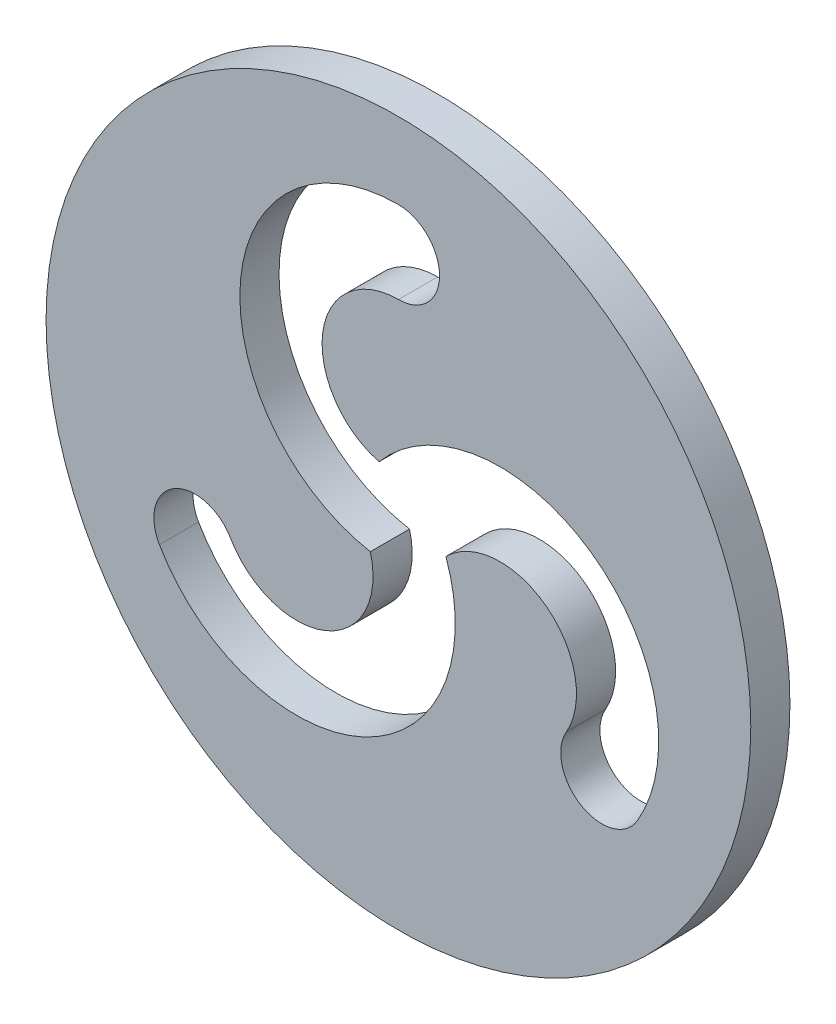
ISO-10303-21;
HEADER;
FILE_DESCRIPTION(('STEP AP214'),'2;1');
FILE_NAME('part.step','',(''),(''),'','','');
FILE_SCHEMA(('AUTOMOTIVE_DESIGN { 1 0 10303 214 1 1 1 1 }'));
ENDSEC;
DATA;
#1=APPLICATION_CONTEXT('core data for automotive mechanical design processes');
#2=APPLICATION_PROTOCOL_DEFINITION('international standard','automotive_design',2000,#1);
#3=PRODUCT_CONTEXT('',#1,'mechanical');
#4=PRODUCT('Part','Part','',(#3));
#5=PRODUCT_RELATED_PRODUCT_CATEGORY('part','',(#4));
#6=PRODUCT_DEFINITION_FORMATION('','',#4);
#7=PRODUCT_DEFINITION_CONTEXT('part definition',#1,'design');
#8=PRODUCT_DEFINITION('design','',#6,#7);
#9=PRODUCT_DEFINITION_SHAPE('','',#8);
#10=(LENGTH_UNIT() NAMED_UNIT(*) SI_UNIT(.MILLI.,.METRE.));
#11=(NAMED_UNIT(*) PLANE_ANGLE_UNIT() SI_UNIT($,.RADIAN.));
#12=(NAMED_UNIT(*) SI_UNIT($,.STERADIAN.) SOLID_ANGLE_UNIT());
#13=UNCERTAINTY_MEASURE_WITH_UNIT(LENGTH_MEASURE(1.E-05),#10,'distance_accuracy_value','');
#14=(GEOMETRIC_REPRESENTATION_CONTEXT(3) GLOBAL_UNCERTAINTY_ASSIGNED_CONTEXT((#13)) GLOBAL_UNIT_ASSIGNED_CONTEXT((#10,
#11,#12)) REPRESENTATION_CONTEXT('',''));
#15=CARTESIAN_POINT('',(0.,0.,0.));
#16=DIRECTION('',(0.,0.,1.));
#17=DIRECTION('',(1.,0.,0.));
#18=AXIS2_PLACEMENT_3D('',#15,#16,#17);
#19=CARTESIAN_POINT('',(0.,0.,5.));
#20=DIRECTION('',(0.,0.,-1.));
#21=DIRECTION('',(-1.,0.,0.));
#22=AXIS2_PLACEMENT_3D('',#19,#20,#21);
#23=CYLINDRICAL_SURFACE('',#22,45.);
#24=CARTESIAN_POINT('',(0.,0.,5.));
#25=DIRECTION('',(0.,0.,1.));
#26=DIRECTION('',(1.,0.,0.));
#27=AXIS2_PLACEMENT_3D('',#24,#25,#26);
#28=CIRCLE('',#27,45.);
#29=CARTESIAN_POINT('',(45.,0.,5.));
#30=VERTEX_POINT('',#29);
#31=EDGE_CURVE('E12',#30,#30,#28,.T.);
#32=ORIENTED_EDGE('',*,*,#31,.F.);
#33=EDGE_LOOP('',(#32));
#34=FACE_BOUND('',#33,.T.);
#35=CARTESIAN_POINT('',(0.,0.,0.));
#36=DIRECTION('',(0.,0.,1.));
#37=DIRECTION('',(1.,0.,0.));
#38=AXIS2_PLACEMENT_3D('',#35,#36,#37);
#39=CIRCLE('',#38,45.);
#40=CARTESIAN_POINT('',(45.,0.,0.));
#41=VERTEX_POINT('',#40);
#42=EDGE_CURVE('E69',#41,#41,#39,.T.);
#43=ORIENTED_EDGE('',*,*,#42,.T.);
#44=EDGE_LOOP('',(#43));
#45=FACE_BOUND('',#44,.T.);
#46=ADVANCED_FACE('F66',(#34,#45),#23,.T.);
#47=CARTESIAN_POINT('',(0.,0.,5.));
#48=DIRECTION('',(0.,0.,1.));
#49=DIRECTION('',(1.,0.,0.));
#50=AXIS2_PLACEMENT_3D('',#47,#48,#49);
#51=PLANE('',#50);
#52=CARTESIAN_POINT('',(0.,15.,5.));
#53=DIRECTION('',(0.,0.,1.));
#54=DIRECTION('',(1.,0.,0.));
#55=AXIS2_PLACEMENT_3D('',#52,#53,#54);
#56=CIRCLE('',#55,20.25);
#57=CARTESIAN_POINT('',(0.,35.25,5.));
#58=VERTEX_POINT('',#57);
#59=CARTESIAN_POINT('',(-3.58516212247075,-4.93010568350306,5.));
#60=VERTEX_POINT('',#59);
#61=EDGE_CURVE('E80',#58,#60,#56,.T.);
#62=ORIENTED_EDGE('',*,*,#61,.F.);
#63=CARTESIAN_POINT('',(0.,30.,5.));
#64=DIRECTION('',(0.,0.,1.));
#65=DIRECTION('',(1.,0.,0.));
#66=AXIS2_PLACEMENT_3D('',#63,#64,#65);
#67=CIRCLE('',#66,5.25);
#68=CARTESIAN_POINT('',(0.,24.75,5.));
#69=VERTEX_POINT('',#68);
#70=EDGE_CURVE('E155',#69,#58,#67,.T.);
#71=ORIENTED_EDGE('',*,*,#70,.F.);
#72=CARTESIAN_POINT('',(0.,15.,5.));
#73=DIRECTION('',(0.,0.,1.));
#74=DIRECTION('',(1.,0.,0.));
#75=AXIS2_PLACEMENT_3D('',#72,#73,#74);
#76=CIRCLE('',#75,9.75);
#77=CARTESIAN_POINT('',(-2.47701570402032,5.56989431649694,5.));
#78=VERTEX_POINT('',#77);
#79=EDGE_CURVE('E158',#69,#78,#76,.T.);
#80=ORIENTED_EDGE('',*,*,#79,.T.);
#81=CARTESIAN_POINT('',(12.9903810567666,-7.49999999999999,5.));
#82=DIRECTION('',(0.,0.,1.));
#83=DIRECTION('',(1.,0.,0.));
#84=AXIS2_PLACEMENT_3D('',#81,#82,#83);
#85=CIRCLE('',#84,20.25);
#86=CARTESIAN_POINT('',(30.5273954834037,-17.6249999999983,5.));
#87=VERTEX_POINT('',#86);
#88=EDGE_CURVE('E191',#87,#78,#85,.T.);
#89=ORIENTED_EDGE('',*,*,#88,.F.);
#90=CARTESIAN_POINT('',(25.9807621135351,-14.9999999999989,5.));
#91=DIRECTION('',(0.,0.,1.));
#92=DIRECTION('',(1.,0.,0.));
#93=AXIS2_PLACEMENT_3D('',#90,#91,#92);
#94=CIRCLE('',#93,5.25);
#95=CARTESIAN_POINT('',(21.4341287436663,-12.3749999999994,5.));
#96=VERTEX_POINT('',#95);
#97=EDGE_CURVE('E188',#96,#87,#94,.T.);
#98=ORIENTED_EDGE('',*,*,#97,.F.);
#99=CARTESIAN_POINT('',(12.9903810567666,-7.49999999999999,5.));
#100=DIRECTION('',(0.,0.,1.));
#101=DIRECTION('',(1.,0.,0.));
#102=AXIS2_PLACEMENT_3D('',#99,#100,#101);
#103=CIRCLE('',#102,9.75);
#104=CARTESIAN_POINT('',(6.06217782649108,-0.639788632993871,5.));
#105=VERTEX_POINT('',#104);
#106=EDGE_CURVE('E185',#96,#105,#103,.T.);
#107=ORIENTED_EDGE('',*,*,#106,.T.);
#108=CARTESIAN_POINT('',(-12.9903810567666,-7.50000000000001,5.));
#109=DIRECTION('',(0.,0.,1.));
#110=DIRECTION('',(1.,0.,0.));
#111=AXIS2_PLACEMENT_3D('',#108,#109,#110);
#112=CIRCLE('',#111,20.25);
#113=CARTESIAN_POINT('',(-30.5273954833992,-17.6250000000017,5.));
#114=VERTEX_POINT('',#113);
#115=EDGE_CURVE('E182',#114,#105,#112,.T.);
#116=ORIENTED_EDGE('',*,*,#115,.F.);
#117=CARTESIAN_POINT('',(-25.9807621135312,-15.0000000000011,5.));
#118=DIRECTION('',(0.,0.,1.));
#119=DIRECTION('',(1.,0.,0.));
#120=AXIS2_PLACEMENT_3D('',#117,#118,#119);
#121=CIRCLE('',#120,5.25);
#122=CARTESIAN_POINT('',(-21.4341287436634,-12.3750000000006,5.));
#123=VERTEX_POINT('',#122);
#124=EDGE_CURVE('E179',#123,#114,#121,.T.);
#125=ORIENTED_EDGE('',*,*,#124,.F.);
#126=CARTESIAN_POINT('',(-12.9903810567666,-7.50000000000001,5.));
#127=DIRECTION('',(0.,0.,1.));
#128=DIRECTION('',(1.,0.,0.));
#129=AXIS2_PLACEMENT_3D('',#126,#127,#128);
#130=CIRCLE('',#129,9.75);
#131=EDGE_CURVE('E177',#123,#60,#130,.T.);
#132=ORIENTED_EDGE('',*,*,#131,.T.);
#133=EDGE_LOOP('',(#62,#71,#80,#89,#98,#107,#116,#125,#132));
#134=FACE_BOUND('',#133,.T.);
#135=ORIENTED_EDGE('',*,*,#31,.T.);
#136=EDGE_LOOP('',(#135));
#137=FACE_BOUND('',#136,.T.);
#138=ADVANCED_FACE('F214',(#134,#137),#51,.T.);
#139=CARTESIAN_POINT('',(0.,0.,0.));
#140=DIRECTION('',(0.,0.,1.));
#141=DIRECTION('',(1.,0.,0.));
#142=AXIS2_PLACEMENT_3D('',#139,#140,#141);
#143=PLANE('',#142);
#144=CARTESIAN_POINT('',(0.,30.,0.));
#145=DIRECTION('',(0.,0.,1.));
#146=DIRECTION('',(1.,0.,0.));
#147=AXIS2_PLACEMENT_3D('',#144,#145,#146);
#148=CIRCLE('',#147,5.25);
#149=CARTESIAN_POINT('',(0.,24.75,0.));
#150=VERTEX_POINT('',#149);
#151=CARTESIAN_POINT('',(0.,35.25,0.));
#152=VERTEX_POINT('',#151);
#153=EDGE_CURVE('E149',#150,#152,#148,.T.);
#154=ORIENTED_EDGE('',*,*,#153,.T.);
#155=CARTESIAN_POINT('',(0.,15.,0.));
#156=DIRECTION('',(0.,0.,1.));
#157=DIRECTION('',(1.,0.,0.));
#158=AXIS2_PLACEMENT_3D('',#155,#156,#157);
#159=CIRCLE('',#158,20.25);
#160=CARTESIAN_POINT('',(-3.58516212247075,-4.93010568350306,0.));
#161=VERTEX_POINT('',#160);
#162=EDGE_CURVE('E144',#152,#161,#159,.T.);
#163=ORIENTED_EDGE('',*,*,#162,.T.);
#164=CARTESIAN_POINT('',(-12.9903810567666,-7.50000000000001,0.));
#165=DIRECTION('',(0.,0.,1.));
#166=DIRECTION('',(1.,0.,0.));
#167=AXIS2_PLACEMENT_3D('',#164,#165,#166);
#168=CIRCLE('',#167,9.75);
#169=CARTESIAN_POINT('',(-21.4341287436642,-12.3750000000011,0.));
#170=VERTEX_POINT('',#169);
#171=EDGE_CURVE('E136',#170,#161,#168,.T.);
#172=ORIENTED_EDGE('',*,*,#171,.F.);
#173=CARTESIAN_POINT('',(-25.9807621135312,-15.0000000000011,0.));
#174=DIRECTION('',(0.,0.,1.));
#175=DIRECTION('',(1.,0.,0.));
#176=AXIS2_PLACEMENT_3D('',#173,#174,#175);
#177=CIRCLE('',#176,5.25);
#178=CARTESIAN_POINT('',(-30.5273954833992,-17.6250000000017,0.));
#179=VERTEX_POINT('',#178);
#180=EDGE_CURVE('E88',#170,#179,#177,.T.);
#181=ORIENTED_EDGE('',*,*,#180,.T.);
#182=CARTESIAN_POINT('',(-12.9903810567666,-7.50000000000001,0.));
#183=DIRECTION('',(0.,0.,1.));
#184=DIRECTION('',(1.,0.,0.));
#185=AXIS2_PLACEMENT_3D('',#182,#183,#184);
#186=CIRCLE('',#185,20.25);
#187=CARTESIAN_POINT('',(6.06217782649108,-0.639788632993871,0.));
#188=VERTEX_POINT('',#187);
#189=EDGE_CURVE('E162',#179,#188,#186,.T.);
#190=ORIENTED_EDGE('',*,*,#189,.T.);
#191=CARTESIAN_POINT('',(12.9903810567666,-7.49999999999999,0.));
#192=DIRECTION('',(0.,0.,1.));
#193=DIRECTION('',(1.,0.,0.));
#194=AXIS2_PLACEMENT_3D('',#191,#192,#193);
#195=CIRCLE('',#194,9.75);
#196=CARTESIAN_POINT('',(21.4341287436663,-12.3749999999994,0.));
#197=VERTEX_POINT('',#196);
#198=EDGE_CURVE('E165',#197,#188,#195,.T.);
#199=ORIENTED_EDGE('',*,*,#198,.F.);
#200=CARTESIAN_POINT('',(25.9807621135351,-14.9999999999989,0.));
#201=DIRECTION('',(0.,0.,1.));
#202=DIRECTION('',(1.,0.,0.));
#203=AXIS2_PLACEMENT_3D('',#200,#201,#202);
#204=CIRCLE('',#203,5.25);
#205=CARTESIAN_POINT('',(30.5273954834037,-17.6249999999983,0.));
#206=VERTEX_POINT('',#205);
#207=EDGE_CURVE('E167',#197,#206,#204,.T.);
#208=ORIENTED_EDGE('',*,*,#207,.T.);
#209=CARTESIAN_POINT('',(12.9903810567666,-7.49999999999999,0.));
#210=DIRECTION('',(0.,0.,1.));
#211=DIRECTION('',(1.,0.,0.));
#212=AXIS2_PLACEMENT_3D('',#209,#210,#211);
#213=CIRCLE('',#212,20.25);
#214=CARTESIAN_POINT('',(-2.47701570402032,5.56989431649694,0.));
#215=VERTEX_POINT('',#214);
#216=EDGE_CURVE('E170',#206,#215,#213,.T.);
#217=ORIENTED_EDGE('',*,*,#216,.T.);
#218=CARTESIAN_POINT('',(0.,15.,0.));
#219=DIRECTION('',(0.,0.,1.));
#220=DIRECTION('',(1.,0.,0.));
#221=AXIS2_PLACEMENT_3D('',#218,#219,#220);
#222=CIRCLE('',#221,9.75);
#223=EDGE_CURVE('E173',#150,#215,#222,.T.);
#224=ORIENTED_EDGE('',*,*,#223,.F.);
#225=EDGE_LOOP('',(#154,#163,#172,#181,#190,#199,#208,#217,#224));
#226=FACE_BOUND('',#225,.T.);
#227=ORIENTED_EDGE('',*,*,#42,.F.);
#228=EDGE_LOOP('',(#227));
#229=FACE_BOUND('',#228,.T.);
#230=ADVANCED_FACE('F151',(#226,#229),#143,.F.);
#231=CARTESIAN_POINT('',(0.,15.,0.));
#232=DIRECTION('',(0.,0.,1.));
#233=DIRECTION('',(1.,0.,0.));
#234=AXIS2_PLACEMENT_3D('',#231,#232,#233);
#235=CYLINDRICAL_SURFACE('',#234,20.25);
#236=ORIENTED_EDGE('',*,*,#61,.T.);
#237=DIRECTION('',(0.,0.,1.));
#238=VECTOR('',#237,1.);
#239=CARTESIAN_POINT('',(-3.58516212247075,-4.93010568350306,0.));
#240=LINE('',#239,#238);
#241=EDGE_CURVE('E139',#161,#60,#240,.T.);
#242=ORIENTED_EDGE('',*,*,#241,.F.);
#243=ORIENTED_EDGE('',*,*,#162,.F.);
#244=DIRECTION('',(0.,0.,1.));
#245=VECTOR('',#244,1.);
#246=CARTESIAN_POINT('',(0.,35.25,0.));
#247=LINE('',#246,#245);
#248=EDGE_CURVE('E196',#152,#58,#247,.T.);
#249=ORIENTED_EDGE('',*,*,#248,.T.);
#250=EDGE_LOOP('',(#236,#242,#243,#249));
#251=FACE_BOUND('',#250,.T.);
#252=ADVANCED_FACE('F147',(#251),#235,.F.);
#253=CARTESIAN_POINT('',(0.,30.,0.));
#254=DIRECTION('',(0.,0.,1.));
#255=DIRECTION('',(1.,0.,0.));
#256=AXIS2_PLACEMENT_3D('',#253,#254,#255);
#257=CYLINDRICAL_SURFACE('',#256,5.25);
#258=ORIENTED_EDGE('',*,*,#70,.T.);
#259=ORIENTED_EDGE('',*,*,#248,.F.);
#260=ORIENTED_EDGE('',*,*,#153,.F.);
#261=DIRECTION('',(0.,0.,1.));
#262=VECTOR('',#261,1.);
#263=CARTESIAN_POINT('',(0.,24.75,0.));
#264=LINE('',#263,#262);
#265=EDGE_CURVE('E198',#150,#69,#264,.T.);
#266=ORIENTED_EDGE('',*,*,#265,.T.);
#267=EDGE_LOOP('',(#258,#259,#260,#266));
#268=FACE_BOUND('',#267,.T.);
#269=ADVANCED_FACE('F238',(#268),#257,.F.);
#270=CARTESIAN_POINT('',(0.,15.,0.));
#271=DIRECTION('',(0.,0.,1.));
#272=DIRECTION('',(1.,0.,0.));
#273=AXIS2_PLACEMENT_3D('',#270,#271,#272);
#274=CYLINDRICAL_SURFACE('',#273,9.75);
#275=ORIENTED_EDGE('',*,*,#79,.F.);
#276=ORIENTED_EDGE('',*,*,#265,.F.);
#277=ORIENTED_EDGE('',*,*,#223,.T.);
#278=DIRECTION('',(0.,0.,1.));
#279=VECTOR('',#278,1.);
#280=CARTESIAN_POINT('',(-2.47701570402032,5.56989431649694,0.));
#281=LINE('',#280,#279);
#282=EDGE_CURVE('E200',#215,#78,#281,.T.);
#283=ORIENTED_EDGE('',*,*,#282,.T.);
#284=EDGE_LOOP('',(#275,#276,#277,#283));
#285=FACE_BOUND('',#284,.T.);
#286=ADVANCED_FACE('F235',(#285),#274,.T.);
#287=CARTESIAN_POINT('',(12.9903810567666,-7.49999999999999,0.));
#288=DIRECTION('',(0.,0.,1.));
#289=DIRECTION('',(1.,0.,0.));
#290=AXIS2_PLACEMENT_3D('',#287,#288,#289);
#291=CYLINDRICAL_SURFACE('',#290,20.25);
#292=ORIENTED_EDGE('',*,*,#88,.T.);
#293=ORIENTED_EDGE('',*,*,#282,.F.);
#294=ORIENTED_EDGE('',*,*,#216,.F.);
#295=DIRECTION('',(0.,0.,1.));
#296=VECTOR('',#295,1.);
#297=CARTESIAN_POINT('',(30.5273954834037,-17.6249999999983,0.));
#298=LINE('',#297,#296);
#299=EDGE_CURVE('E202',#206,#87,#298,.T.);
#300=ORIENTED_EDGE('',*,*,#299,.T.);
#301=EDGE_LOOP('',(#292,#293,#294,#300));
#302=FACE_BOUND('',#301,.T.);
#303=ADVANCED_FACE('F232',(#302),#291,.F.);
#304=CARTESIAN_POINT('',(25.9807621135351,-14.9999999999989,0.));
#305=DIRECTION('',(0.,0.,1.));
#306=DIRECTION('',(1.,0.,0.));
#307=AXIS2_PLACEMENT_3D('',#304,#305,#306);
#308=CYLINDRICAL_SURFACE('',#307,5.25);
#309=ORIENTED_EDGE('',*,*,#97,.T.);
#310=ORIENTED_EDGE('',*,*,#299,.F.);
#311=ORIENTED_EDGE('',*,*,#207,.F.);
#312=DIRECTION('',(0.,0.,1.));
#313=VECTOR('',#312,1.);
#314=CARTESIAN_POINT('',(21.4341287436663,-12.3749999999994,0.));
#315=LINE('',#314,#313);
#316=EDGE_CURVE('E204',#197,#96,#315,.T.);
#317=ORIENTED_EDGE('',*,*,#316,.T.);
#318=EDGE_LOOP('',(#309,#310,#311,#317));
#319=FACE_BOUND('',#318,.T.);
#320=ADVANCED_FACE('F227',(#319),#308,.F.);
#321=CARTESIAN_POINT('',(12.9903810567666,-7.49999999999999,0.));
#322=DIRECTION('',(0.,0.,1.));
#323=DIRECTION('',(1.,0.,0.));
#324=AXIS2_PLACEMENT_3D('',#321,#322,#323);
#325=CYLINDRICAL_SURFACE('',#324,9.75);
#326=ORIENTED_EDGE('',*,*,#106,.F.);
#327=ORIENTED_EDGE('',*,*,#316,.F.);
#328=ORIENTED_EDGE('',*,*,#198,.T.);
#329=DIRECTION('',(0.,0.,1.));
#330=VECTOR('',#329,1.);
#331=CARTESIAN_POINT('',(6.06217782649108,-0.639788632993871,0.));
#332=LINE('',#331,#330);
#333=EDGE_CURVE('E206',#188,#105,#332,.T.);
#334=ORIENTED_EDGE('',*,*,#333,.T.);
#335=EDGE_LOOP('',(#326,#327,#328,#334));
#336=FACE_BOUND('',#335,.T.);
#337=ADVANCED_FACE('F225',(#336),#325,.T.);
#338=CARTESIAN_POINT('',(-12.9903810567666,-7.50000000000001,0.));
#339=DIRECTION('',(0.,0.,1.));
#340=DIRECTION('',(1.,0.,0.));
#341=AXIS2_PLACEMENT_3D('',#338,#339,#340);
#342=CYLINDRICAL_SURFACE('',#341,20.25);
#343=ORIENTED_EDGE('',*,*,#115,.T.);
#344=ORIENTED_EDGE('',*,*,#333,.F.);
#345=ORIENTED_EDGE('',*,*,#189,.F.);
#346=DIRECTION('',(0.,0.,1.));
#347=VECTOR('',#346,1.);
#348=CARTESIAN_POINT('',(-30.5273954833992,-17.6250000000017,0.));
#349=LINE('',#348,#347);
#350=EDGE_CURVE('E208',#179,#114,#349,.T.);
#351=ORIENTED_EDGE('',*,*,#350,.T.);
#352=EDGE_LOOP('',(#343,#344,#345,#351));
#353=FACE_BOUND('',#352,.T.);
#354=ADVANCED_FACE('F220',(#353),#342,.F.);
#355=CARTESIAN_POINT('',(-25.9807621135312,-15.0000000000011,0.));
#356=DIRECTION('',(0.,0.,1.));
#357=DIRECTION('',(1.,0.,0.));
#358=AXIS2_PLACEMENT_3D('',#355,#356,#357);
#359=CYLINDRICAL_SURFACE('',#358,5.25);
#360=ORIENTED_EDGE('',*,*,#124,.T.);
#361=ORIENTED_EDGE('',*,*,#350,.F.);
#362=ORIENTED_EDGE('',*,*,#180,.F.);
#363=DIRECTION('',(0.,0.,1.));
#364=VECTOR('',#363,1.);
#365=CARTESIAN_POINT('',(-21.4341287436634,-12.3750000000006,0.));
#366=LINE('',#365,#364);
#367=EDGE_CURVE('E141',#170,#123,#366,.T.);
#368=ORIENTED_EDGE('',*,*,#367,.T.);
#369=EDGE_LOOP('',(#360,#361,#362,#368));
#370=FACE_BOUND('',#369,.T.);
#371=ADVANCED_FACE('F210',(#370),#359,.F.);
#372=CARTESIAN_POINT('',(-12.9903810567666,-7.50000000000001,0.));
#373=DIRECTION('',(0.,0.,1.));
#374=DIRECTION('',(1.,0.,0.));
#375=AXIS2_PLACEMENT_3D('',#372,#373,#374);
#376=CYLINDRICAL_SURFACE('',#375,9.75);
#377=ORIENTED_EDGE('',*,*,#131,.F.);
#378=ORIENTED_EDGE('',*,*,#367,.F.);
#379=ORIENTED_EDGE('',*,*,#171,.T.);
#380=ORIENTED_EDGE('',*,*,#241,.T.);
#381=EDGE_LOOP('',(#377,#378,#379,#380));
#382=FACE_BOUND('',#381,.T.);
#383=ADVANCED_FACE('F138',(#382),#376,.T.);
#384=CLOSED_SHELL('',(#46,#138,#230,#252,#269,#286,#303,#320,#337,#354,#371,#383));
#385=MANIFOLD_SOLID_BREP('B2',#384);
#386=ADVANCED_BREP_SHAPE_REPRESENTATION('',(#18,#385),#14);
#387=SHAPE_DEFINITION_REPRESENTATION(#9,#386);
ENDSEC;
END-ISO-10303-21;
